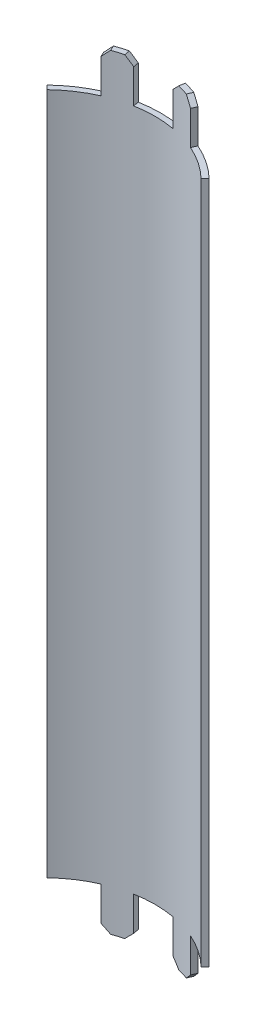
ISO-10303-21;
HEADER;
FILE_DESCRIPTION(('STEP AP214'),'2;1');
FILE_NAME('part.step','',(''),(''),'','','');
FILE_SCHEMA(('AUTOMOTIVE_DESIGN { 1 0 10303 214 1 1 1 1 }'));
ENDSEC;
DATA;
#1=APPLICATION_CONTEXT('core data for automotive mechanical design processes');
#2=APPLICATION_PROTOCOL_DEFINITION('international standard','automotive_design',2000,#1);
#3=PRODUCT_CONTEXT('',#1,'mechanical');
#4=PRODUCT('Part','Part','',(#3));
#5=PRODUCT_RELATED_PRODUCT_CATEGORY('part','',(#4));
#6=PRODUCT_DEFINITION_FORMATION('','',#4);
#7=PRODUCT_DEFINITION_CONTEXT('part definition',#1,'design');
#8=PRODUCT_DEFINITION('design','',#6,#7);
#9=PRODUCT_DEFINITION_SHAPE('','',#8);
#10=(LENGTH_UNIT() NAMED_UNIT(*) SI_UNIT(.MILLI.,.METRE.));
#11=(NAMED_UNIT(*) PLANE_ANGLE_UNIT() SI_UNIT($,.RADIAN.));
#12=(NAMED_UNIT(*) SI_UNIT($,.STERADIAN.) SOLID_ANGLE_UNIT());
#13=UNCERTAINTY_MEASURE_WITH_UNIT(LENGTH_MEASURE(1.E-05),#10,'distance_accuracy_value','');
#14=(GEOMETRIC_REPRESENTATION_CONTEXT(3) GLOBAL_UNCERTAINTY_ASSIGNED_CONTEXT((#13)) GLOBAL_UNIT_ASSIGNED_CONTEXT((#10,
#11,#12)) REPRESENTATION_CONTEXT('',''));
#15=CARTESIAN_POINT('',(0.,0.,0.));
#16=DIRECTION('',(0.,0.,1.));
#17=DIRECTION('',(1.,0.,0.));
#18=AXIS2_PLACEMENT_3D('',#15,#16,#17);
#19=CARTESIAN_POINT('',(0.,101.5,0.));
#20=DIRECTION('',(0.,-1.,0.));
#21=DIRECTION('',(0.,0.,-1.));
#22=AXIS2_PLACEMENT_3D('',#19,#20,#21);
#23=CYLINDRICAL_SURFACE('',#22,31.);
#24=DIRECTION('',(0.,-1.,0.));
#25=VECTOR('',#24,1.);
#26=CARTESIAN_POINT('',(12.5001761357445,101.5,-28.3680382926871));
#27=LINE('',#26,#25);
#28=CARTESIAN_POINT('',(12.5001761357445,-90.4999999999999,-28.3680382926871));
#29=VERTEX_POINT('',#28);
#30=CARTESIAN_POINT('',(12.5001761357445,-99.5,-28.3680382926871));
#31=VERTEX_POINT('',#30);
#32=EDGE_CURVE('E241',#29,#31,#27,.T.);
#33=ORIENTED_EDGE('',*,*,#32,.T.);
#34=CARTESIAN_POINT('',(0.,-99.5,0.));
#35=DIRECTION('',(0.647072007926405,-0.707106781186553,0.285127719729392));
#36=DIRECTION('',(-0.647072007926415,-0.707106781186542,-0.285127719729396));
#37=AXIS2_PLACEMENT_3D('',#34,#35,#36);
#38=ELLIPSE('',#37,43.8406204335656,31.);
#39=CARTESIAN_POINT('',(10.6439380549584,-101.5,-29.1154011252156));
#40=VERTEX_POINT('',#39);
#41=EDGE_CURVE('E405',#31,#40,#38,.F.);
#42=ORIENTED_EDGE('',*,*,#41,.T.);
#43=CARTESIAN_POINT('',(0.,-101.5,0.));
#44=DIRECTION('',(0.,1.,0.));
#45=DIRECTION('',(1.,0.,0.));
#46=AXIS2_PLACEMENT_3D('',#43,#44,#45);
#47=CIRCLE('',#46,31.);
#48=CARTESIAN_POINT('',(7.42170587117048,-101.5,-30.0984764059883));
#49=VERTEX_POINT('',#48);
#50=EDGE_CURVE('E375',#40,#49,#47,.T.);
#51=ORIENTED_EDGE('',*,*,#50,.T.);
#52=CARTESIAN_POINT('',(0.,-99.5,0.));
#53=DIRECTION('',(0.696034650297958,0.707106781186545,0.124642551260002));
#54=DIRECTION('',(0.696034650297954,-0.70710678118655,0.124642551260001));
#55=AXIS2_PLACEMENT_3D('',#52,#53,#54);
#56=ELLIPSE('',#55,43.8406204335661,31.);
#57=CARTESIAN_POINT('',(5.46440677966102,-99.4999999999999,-30.5145909123225));
#58=VERTEX_POINT('',#57);
#59=EDGE_CURVE('E403',#49,#58,#56,.T.);
#60=ORIENTED_EDGE('',*,*,#59,.T.);
#61=DIRECTION('',(0.,-1.,0.));
#62=VECTOR('',#61,1.);
#63=CARTESIAN_POINT('',(5.46440677966102,101.5,-30.5145909123225));
#64=LINE('',#63,#62);
#65=CARTESIAN_POINT('',(5.46440677966102,-90.4999999999999,-30.5145909123225));
#66=VERTEX_POINT('',#65);
#67=EDGE_CURVE('E294',#66,#58,#64,.T.);
#68=ORIENTED_EDGE('',*,*,#67,.F.);
#69=CARTESIAN_POINT('',(0.,-90.4999999999999,0.));
#70=DIRECTION('',(0.,-1.,0.));
#71=DIRECTION('',(0.,0.,-1.));
#72=AXIS2_PLACEMENT_3D('',#69,#70,#71);
#73=CIRCLE('',#72,31.);
#74=CARTESIAN_POINT('',(-5.46440677966102,-90.4999999999999,-30.5145909123225));
#75=VERTEX_POINT('',#74);
#76=EDGE_CURVE('E292',#75,#66,#73,.T.);
#77=ORIENTED_EDGE('',*,*,#76,.F.);
#78=DIRECTION('',(0.,-1.,0.));
#79=VECTOR('',#78,1.);
#80=CARTESIAN_POINT('',(-5.46440677966102,101.5,-30.5145909123225));
#81=LINE('',#80,#79);
#82=CARTESIAN_POINT('',(-5.46440677966102,-99.5,-30.5145909123225));
#83=VERTEX_POINT('',#82);
#84=EDGE_CURVE('E288',#75,#83,#81,.T.);
#85=ORIENTED_EDGE('',*,*,#84,.T.);
#86=CARTESIAN_POINT('',(0.,-99.5,0.));
#87=DIRECTION('',(0.696034650297953,-0.70710678118655,-0.124642551260001));
#88=DIRECTION('',(-0.696034650297959,-0.707106781186545,0.124642551260002));
#89=AXIS2_PLACEMENT_3D('',#86,#87,#88);
#90=ELLIPSE('',#89,43.8406204335658,31.);
#91=CARTESIAN_POINT('',(-7.42170587117053,-101.5,-30.0984764059883));
#92=VERTEX_POINT('',#91);
#93=EDGE_CURVE('E401',#83,#92,#90,.F.);
#94=ORIENTED_EDGE('',*,*,#93,.T.);
#95=CARTESIAN_POINT('',(-10.6439380549584,-101.5,-29.1154011252157));
#96=VERTEX_POINT('',#95);
#97=EDGE_CURVE('E362',#92,#96,#47,.T.);
#98=ORIENTED_EDGE('',*,*,#97,.T.);
#99=CARTESIAN_POINT('',(0.,-99.5,0.));
#100=DIRECTION('',(0.647072007926404,0.707106781186554,-0.285127719729392));
#101=DIRECTION('',(0.647072007926416,-0.707106781186541,-0.285127719729397));
#102=AXIS2_PLACEMENT_3D('',#99,#100,#101);
#103=ELLIPSE('',#102,43.8406204335656,31.);
#104=CARTESIAN_POINT('',(-12.5001761357445,-99.5,-28.3680382926871));
#105=VERTEX_POINT('',#104);
#106=EDGE_CURVE('E399',#96,#105,#103,.T.);
#107=ORIENTED_EDGE('',*,*,#106,.T.);
#108=DIRECTION('',(0.,-1.,0.));
#109=VECTOR('',#108,1.);
#110=CARTESIAN_POINT('',(-12.5001761357445,-90.5,-28.3680382926871));
#111=LINE('',#110,#109);
#112=CARTESIAN_POINT('',(-12.5001761357445,-90.5,-28.3680382926871));
#113=VERTEX_POINT('',#112);
#114=EDGE_CURVE('E278',#113,#105,#111,.T.);
#115=ORIENTED_EDGE('',*,*,#114,.F.);
#116=CARTESIAN_POINT('',(0.,-90.5,0.));
#117=DIRECTION('',(0.,-1.,0.));
#118=DIRECTION('',(0.,0.,-1.));
#119=AXIS2_PLACEMENT_3D('',#116,#117,#118);
#120=CIRCLE('',#119,31.);
#121=CARTESIAN_POINT('',(-21.4898305084746,-90.5,-22.3424972802289));
#122=VERTEX_POINT('',#121);
#123=EDGE_CURVE('E269',#122,#113,#120,.T.);
#124=ORIENTED_EDGE('',*,*,#123,.F.);
#125=DIRECTION('',(0.,-1.,0.));
#126=VECTOR('',#125,1.);
#127=CARTESIAN_POINT('',(-21.4898305084746,101.5,-22.3424972802289));
#128=LINE('',#127,#126);
#129=CARTESIAN_POINT('',(-21.4898305084746,90.5,-22.3424972802289));
#130=VERTEX_POINT('',#129);
#131=EDGE_CURVE('E387',#130,#122,#128,.T.);
#132=ORIENTED_EDGE('',*,*,#131,.F.);
#133=CARTESIAN_POINT('',(0.,90.5,0.));
#134=DIRECTION('',(0.,-1.,0.));
#135=DIRECTION('',(0.,0.,-1.));
#136=AXIS2_PLACEMENT_3D('',#133,#134,#135);
#137=CIRCLE('',#136,31.);
#138=CARTESIAN_POINT('',(-12.5001761357445,90.5,-28.3680382926871));
#139=VERTEX_POINT('',#138);
#140=EDGE_CURVE('E331',#139,#130,#137,.F.);
#141=ORIENTED_EDGE('',*,*,#140,.F.);
#142=DIRECTION('',(0.,-1.,0.));
#143=VECTOR('',#142,1.);
#144=CARTESIAN_POINT('',(-12.5001761357445,101.5,-28.3680382926871));
#145=LINE('',#144,#143);
#146=CARTESIAN_POINT('',(-12.5001761357445,99.5,-28.3680382926871));
#147=VERTEX_POINT('',#146);
#148=EDGE_CURVE('E333',#139,#147,#145,.F.);
#149=ORIENTED_EDGE('',*,*,#148,.T.);
#150=CARTESIAN_POINT('',(0.,99.5,0.));
#151=DIRECTION('',(0.647072007926405,-0.707106781186552,-0.285127719729392));
#152=DIRECTION('',(-0.647072007926415,-0.707106781186543,0.285127719729396));
#153=AXIS2_PLACEMENT_3D('',#150,#151,#152);
#154=ELLIPSE('',#153,43.8406204335656,31.);
#155=CARTESIAN_POINT('',(-10.6439380549584,101.5,-29.1154011252156));
#156=VERTEX_POINT('',#155);
#157=EDGE_CURVE('E391',#147,#156,#154,.T.);
#158=ORIENTED_EDGE('',*,*,#157,.T.);
#159=CARTESIAN_POINT('',(0.,101.5,0.));
#160=DIRECTION('',(0.,1.,0.));
#161=DIRECTION('',(1.,0.,0.));
#162=AXIS2_PLACEMENT_3D('',#159,#160,#161);
#163=CIRCLE('',#162,31.);
#164=CARTESIAN_POINT('',(-7.42170587117054,101.5,-30.0984764059883));
#165=VERTEX_POINT('',#164);
#166=EDGE_CURVE('E369',#165,#156,#163,.T.);
#167=ORIENTED_EDGE('',*,*,#166,.F.);
#168=CARTESIAN_POINT('',(0.,99.5,0.));
#169=DIRECTION('',(0.696034650297953,0.70710678118655,-0.124642551260001));
#170=DIRECTION('',(0.696034650297959,-0.707106781186545,-0.124642551260002));
#171=AXIS2_PLACEMENT_3D('',#168,#169,#170);
#172=ELLIPSE('',#171,43.8406204335658,31.);
#173=CARTESIAN_POINT('',(-5.46440677966102,99.5,-30.5145909123225));
#174=VERTEX_POINT('',#173);
#175=EDGE_CURVE('E393',#165,#174,#172,.F.);
#176=ORIENTED_EDGE('',*,*,#175,.T.);
#177=DIRECTION('',(0.,1.,0.));
#178=VECTOR('',#177,1.);
#179=CARTESIAN_POINT('',(-5.46440677966102,90.5,-30.5145909123225));
#180=LINE('',#179,#178);
#181=CARTESIAN_POINT('',(-5.46440677966102,90.5,-30.5145909123225));
#182=VERTEX_POINT('',#181);
#183=EDGE_CURVE('E320',#182,#174,#180,.T.);
#184=ORIENTED_EDGE('',*,*,#183,.F.);
#185=CARTESIAN_POINT('',(0.,90.5,0.));
#186=DIRECTION('',(0.,1.,0.));
#187=DIRECTION('',(0.,0.,1.));
#188=AXIS2_PLACEMENT_3D('',#185,#186,#187);
#189=CIRCLE('',#188,31.);
#190=CARTESIAN_POINT('',(5.46440677966102,90.5,-30.5145909123225));
#191=VERTEX_POINT('',#190);
#192=EDGE_CURVE('E307',#191,#182,#189,.T.);
#193=ORIENTED_EDGE('',*,*,#192,.F.);
#194=DIRECTION('',(0.,1.,0.));
#195=VECTOR('',#194,1.);
#196=CARTESIAN_POINT('',(5.46440677966102,90.5,-30.5145909123225));
#197=LINE('',#196,#195);
#198=CARTESIAN_POINT('',(5.46440677966102,99.5,-30.5145909123225));
#199=VERTEX_POINT('',#198);
#200=EDGE_CURVE('E312',#191,#199,#197,.T.);
#201=ORIENTED_EDGE('',*,*,#200,.T.);
#202=CARTESIAN_POINT('',(0.,99.5,0.));
#203=DIRECTION('',(0.696034650297958,-0.707106781186545,0.124642551260002));
#204=DIRECTION('',(-0.696034650297954,-0.70710678118655,-0.124642551260001));
#205=AXIS2_PLACEMENT_3D('',#202,#203,#204);
#206=ELLIPSE('',#205,43.8406204335661,31.);
#207=CARTESIAN_POINT('',(7.4217058711705,101.5,-30.0984764059883));
#208=VERTEX_POINT('',#207);
#209=EDGE_CURVE('E395',#199,#208,#206,.T.);
#210=ORIENTED_EDGE('',*,*,#209,.T.);
#211=CARTESIAN_POINT('',(10.6439380549584,101.5,-29.1154011252156));
#212=VERTEX_POINT('',#211);
#213=EDGE_CURVE('E365',#212,#208,#163,.T.);
#214=ORIENTED_EDGE('',*,*,#213,.F.);
#215=CARTESIAN_POINT('',(0.,99.5,0.));
#216=DIRECTION('',(0.647072007926405,0.707106781186552,0.285127719729392));
#217=DIRECTION('',(0.647072007926415,-0.707106781186543,0.285127719729396));
#218=AXIS2_PLACEMENT_3D('',#215,#216,#217);
#219=ELLIPSE('',#218,43.8406204335656,31.);
#220=CARTESIAN_POINT('',(12.5001761357445,99.5,-28.3680382926871));
#221=VERTEX_POINT('',#220);
#222=EDGE_CURVE('E397',#212,#221,#219,.F.);
#223=ORIENTED_EDGE('',*,*,#222,.T.);
#224=DIRECTION('',(0.,1.,0.));
#225=VECTOR('',#224,1.);
#226=CARTESIAN_POINT('',(12.5001761357445,90.5,-28.3680382926871));
#227=LINE('',#226,#225);
#228=CARTESIAN_POINT('',(12.5001761357445,90.5,-28.3680382926871));
#229=VERTEX_POINT('',#228);
#230=EDGE_CURVE('E352',#229,#221,#227,.T.);
#231=ORIENTED_EDGE('',*,*,#230,.F.);
#232=CARTESIAN_POINT('',(0.,90.5,0.));
#233=DIRECTION('',(0.,1.,0.));
#234=DIRECTION('',(0.,0.,1.));
#235=AXIS2_PLACEMENT_3D('',#232,#233,#234);
#236=CIRCLE('',#235,31.);
#237=CARTESIAN_POINT('',(21.4898305084746,90.5,-22.3424972802289));
#238=VERTEX_POINT('',#237);
#239=EDGE_CURVE('E345',#238,#229,#236,.T.);
#240=ORIENTED_EDGE('',*,*,#239,.F.);
#241=DIRECTION('',(0.,-1.,0.));
#242=VECTOR('',#241,1.);
#243=CARTESIAN_POINT('',(21.4898305084746,101.5,-22.3424972802289));
#244=LINE('',#243,#242);
#245=CARTESIAN_POINT('',(21.4898305084746,-90.4999999999999,-22.3424972802289));
#246=VERTEX_POINT('',#245);
#247=EDGE_CURVE('E263',#238,#246,#244,.T.);
#248=ORIENTED_EDGE('',*,*,#247,.T.);
#249=CARTESIAN_POINT('',(0.,-90.4999999999999,0.));
#250=DIRECTION('',(0.,-1.,0.));
#251=DIRECTION('',(0.,0.,-1.));
#252=AXIS2_PLACEMENT_3D('',#249,#250,#251);
#253=CIRCLE('',#252,31.);
#254=EDGE_CURVE('E251',#29,#246,#253,.T.);
#255=ORIENTED_EDGE('',*,*,#254,.F.);
#256=EDGE_LOOP('',(#33,#42,#51,#60,#68,#77,#85,#94,#98,#107,#115,#124,#132,#141,#149,#158,#167,
#176,#184,#193,#201,#210,#214,#223,#231,#240,#248,#255));
#257=FACE_BOUND('',#256,.T.);
#258=ADVANCED_FACE('F52',(#257),#23,.T.);
#259=CARTESIAN_POINT('',(0.,101.5,0.));
#260=DIRECTION('',(0.,-1.,0.));
#261=DIRECTION('',(0.,0.,-1.));
#262=AXIS2_PLACEMENT_3D('',#259,#260,#261);
#263=CYLINDRICAL_SURFACE('',#262,29.5);
#264=CARTESIAN_POINT('',(0.,-101.5,0.));
#265=DIRECTION('',(0.,1.,0.));
#266=DIRECTION('',(0.,0.,1.));
#267=AXIS2_PLACEMENT_3D('',#264,#265,#266);
#268=CIRCLE('',#267,29.5);
#269=CARTESIAN_POINT('',(10.0377636704182,-101.5,-27.739742257217));
#270=VERTEX_POINT('',#269);
#271=CARTESIAN_POINT('',(7.15671893174117,-101.5,-28.6187241877072));
#272=VERTEX_POINT('',#271);
#273=EDGE_CURVE('E379',#270,#272,#268,.T.);
#274=ORIENTED_EDGE('',*,*,#273,.F.);
#275=CARTESIAN_POINT('',(0.,-99.5,0.));
#276=DIRECTION('',(0.647072007926405,-0.707106781186553,0.285127719729392));
#277=DIRECTION('',(-0.647072007926415,-0.707106781186542,-0.285127719729396));
#278=AXIS2_PLACEMENT_3D('',#275,#276,#277);
#279=ELLIPSE('',#278,41.719300090006,29.5);
#280=CARTESIAN_POINT('',(11.8953289033698,-99.5,-26.9953912785248));
#281=VERTEX_POINT('',#280);
#282=EDGE_CURVE('E425',#270,#281,#279,.T.);
#283=ORIENTED_EDGE('',*,*,#282,.T.);
#284=DIRECTION('',(0.,-1.,0.));
#285=VECTOR('',#284,1.);
#286=CARTESIAN_POINT('',(11.8953289033698,-90.5,-26.9953912785248));
#287=LINE('',#286,#285);
#288=CARTESIAN_POINT('',(11.8953289033698,-90.5,-26.9953912785248));
#289=VERTEX_POINT('',#288);
#290=EDGE_CURVE('E264',#289,#281,#287,.T.);
#291=ORIENTED_EDGE('',*,*,#290,.F.);
#292=CARTESIAN_POINT('',(0.,-90.5,0.));
#293=DIRECTION('',(0.,-1.,0.));
#294=DIRECTION('',(0.,0.,-1.));
#295=AXIS2_PLACEMENT_3D('',#292,#293,#294);
#296=CIRCLE('',#295,29.5);
#297=CARTESIAN_POINT('',(20.45,-90.5,-21.2614087021533));
#298=VERTEX_POINT('',#297);
#299=EDGE_CURVE('E257',#289,#298,#296,.T.);
#300=ORIENTED_EDGE('',*,*,#299,.T.);
#301=DIRECTION('',(0.,-1.,0.));
#302=VECTOR('',#301,1.);
#303=CARTESIAN_POINT('',(20.45,101.5,-21.2614087021533));
#304=LINE('',#303,#302);
#305=CARTESIAN_POINT('',(20.45,90.5,-21.2614087021533));
#306=VERTEX_POINT('',#305);
#307=EDGE_CURVE('E381',#306,#298,#304,.T.);
#308=ORIENTED_EDGE('',*,*,#307,.F.);
#309=CARTESIAN_POINT('',(0.,90.5,0.));
#310=DIRECTION('',(0.,-1.,0.));
#311=DIRECTION('',(0.,0.,-1.));
#312=AXIS2_PLACEMENT_3D('',#309,#310,#311);
#313=CIRCLE('',#312,29.5);
#314=CARTESIAN_POINT('',(11.8953289033698,90.5,-26.9953912785248));
#315=VERTEX_POINT('',#314);
#316=EDGE_CURVE('E348',#306,#315,#313,.F.);
#317=ORIENTED_EDGE('',*,*,#316,.T.);
#318=DIRECTION('',(0.,-1.,0.));
#319=VECTOR('',#318,1.);
#320=CARTESIAN_POINT('',(11.8953289033698,101.5,-26.9953912785248));
#321=LINE('',#320,#319);
#322=CARTESIAN_POINT('',(11.8953289033698,99.5,-26.9953912785248));
#323=VERTEX_POINT('',#322);
#324=EDGE_CURVE('E351',#315,#323,#321,.F.);
#325=ORIENTED_EDGE('',*,*,#324,.T.);
#326=CARTESIAN_POINT('',(0.,99.5,0.));
#327=DIRECTION('',(0.647072007926405,0.707106781186552,0.285127719729392));
#328=DIRECTION('',(0.647072007926415,-0.707106781186543,0.285127719729396));
#329=AXIS2_PLACEMENT_3D('',#326,#327,#328);
#330=ELLIPSE('',#329,41.719300090006,29.5);
#331=CARTESIAN_POINT('',(10.0377636704182,101.5,-27.739742257217));
#332=VERTEX_POINT('',#331);
#333=EDGE_CURVE('E418',#323,#332,#330,.T.);
#334=ORIENTED_EDGE('',*,*,#333,.T.);
#335=CARTESIAN_POINT('',(0.,101.5,0.));
#336=DIRECTION('',(0.,1.,0.));
#337=DIRECTION('',(0.,0.,1.));
#338=AXIS2_PLACEMENT_3D('',#335,#336,#337);
#339=CIRCLE('',#338,29.5);
#340=CARTESIAN_POINT('',(7.1567189317412,101.5,-28.6187241877072));
#341=VERTEX_POINT('',#340);
#342=EDGE_CURVE('E372',#332,#341,#339,.T.);
#343=ORIENTED_EDGE('',*,*,#342,.T.);
#344=CARTESIAN_POINT('',(0.,99.5,0.));
#345=DIRECTION('',(0.696034650297958,-0.707106781186545,0.124642551260002));
#346=DIRECTION('',(-0.696034650297954,-0.70710678118655,-0.124642551260001));
#347=AXIS2_PLACEMENT_3D('',#344,#345,#346);
#348=ELLIPSE('',#347,41.7193000900064,29.5);
#349=CARTESIAN_POINT('',(5.2,99.5,-29.038078448823));
#350=VERTEX_POINT('',#349);
#351=EDGE_CURVE('E416',#341,#350,#348,.F.);
#352=ORIENTED_EDGE('',*,*,#351,.T.);
#353=DIRECTION('',(0.,-1.,0.));
#354=VECTOR('',#353,1.);
#355=CARTESIAN_POINT('',(5.2,101.5,-29.038078448823));
#356=LINE('',#355,#354);
#357=CARTESIAN_POINT('',(5.2,90.5,-29.038078448823));
#358=VERTEX_POINT('',#357);
#359=EDGE_CURVE('E313',#358,#350,#356,.F.);
#360=ORIENTED_EDGE('',*,*,#359,.F.);
#361=CARTESIAN_POINT('',(0.,90.5,0.));
#362=DIRECTION('',(0.,-1.,0.));
#363=DIRECTION('',(0.,0.,-1.));
#364=AXIS2_PLACEMENT_3D('',#361,#362,#363);
#365=CIRCLE('',#364,29.5);
#366=CARTESIAN_POINT('',(-5.2,90.5,-29.038078448823));
#367=VERTEX_POINT('',#366);
#368=EDGE_CURVE('E308',#358,#367,#365,.F.);
#369=ORIENTED_EDGE('',*,*,#368,.T.);
#370=DIRECTION('',(0.,-1.,0.));
#371=VECTOR('',#370,1.);
#372=CARTESIAN_POINT('',(-5.2,101.5,-29.038078448823));
#373=LINE('',#372,#371);
#374=CARTESIAN_POINT('',(-5.2,99.5,-29.038078448823));
#375=VERTEX_POINT('',#374);
#376=EDGE_CURVE('E311',#367,#375,#373,.F.);
#377=ORIENTED_EDGE('',*,*,#376,.T.);
#378=CARTESIAN_POINT('',(0.,99.5,0.));
#379=DIRECTION('',(0.696034650297953,0.70710678118655,-0.124642551260001));
#380=DIRECTION('',(0.696034650297959,-0.707106781186545,-0.124642551260002));
#381=AXIS2_PLACEMENT_3D('',#378,#379,#380);
#382=ELLIPSE('',#381,41.7193000900062,29.5);
#383=CARTESIAN_POINT('',(-7.15671893174123,101.5,-28.6187241877072));
#384=VERTEX_POINT('',#383);
#385=EDGE_CURVE('E414',#375,#384,#382,.T.);
#386=ORIENTED_EDGE('',*,*,#385,.T.);
#387=CARTESIAN_POINT('',(-10.0377636704182,101.5,-27.739742257217));
#388=VERTEX_POINT('',#387);
#389=EDGE_CURVE('E368',#384,#388,#339,.T.);
#390=ORIENTED_EDGE('',*,*,#389,.T.);
#391=CARTESIAN_POINT('',(0.,99.5,0.));
#392=DIRECTION('',(0.647072007926405,-0.707106781186552,-0.285127719729392));
#393=DIRECTION('',(-0.647072007926415,-0.707106781186543,0.285127719729396));
#394=AXIS2_PLACEMENT_3D('',#391,#392,#393);
#395=ELLIPSE('',#394,41.719300090006,29.5);
#396=CARTESIAN_POINT('',(-11.8953289033698,99.5,-26.9953912785248));
#397=VERTEX_POINT('',#396);
#398=EDGE_CURVE('E412',#388,#397,#395,.F.);
#399=ORIENTED_EDGE('',*,*,#398,.T.);
#400=DIRECTION('',(0.,1.,0.));
#401=VECTOR('',#400,1.);
#402=CARTESIAN_POINT('',(-11.8953289033698,90.5,-26.9953912785248));
#403=LINE('',#402,#401);
#404=CARTESIAN_POINT('',(-11.8953289033698,90.5,-26.9953912785248));
#405=VERTEX_POINT('',#404);
#406=EDGE_CURVE('E334',#405,#397,#403,.T.);
#407=ORIENTED_EDGE('',*,*,#406,.F.);
#408=CARTESIAN_POINT('',(0.,90.5,0.));
#409=DIRECTION('',(0.,1.,0.));
#410=DIRECTION('',(0.,0.,1.));
#411=AXIS2_PLACEMENT_3D('',#408,#409,#410);
#412=CIRCLE('',#411,29.5);
#413=CARTESIAN_POINT('',(-20.45,90.5,-21.2614087021533));
#414=VERTEX_POINT('',#413);
#415=EDGE_CURVE('E328',#405,#414,#412,.T.);
#416=ORIENTED_EDGE('',*,*,#415,.T.);
#417=DIRECTION('',(0.,-1.,0.));
#418=VECTOR('',#417,1.);
#419=CARTESIAN_POINT('',(-20.45,101.5,-21.2614087021533));
#420=LINE('',#419,#418);
#421=CARTESIAN_POINT('',(-20.45,-90.4999999999999,-21.2614087021533));
#422=VERTEX_POINT('',#421);
#423=EDGE_CURVE('E384',#414,#422,#420,.T.);
#424=ORIENTED_EDGE('',*,*,#423,.T.);
#425=CARTESIAN_POINT('',(0.,-90.4999999999999,0.));
#426=DIRECTION('',(0.,-1.,0.));
#427=DIRECTION('',(0.,0.,-1.));
#428=AXIS2_PLACEMENT_3D('',#425,#426,#427);
#429=CIRCLE('',#428,29.5);
#430=CARTESIAN_POINT('',(-11.8953289033698,-90.4999999999999,-26.9953912785248));
#431=VERTEX_POINT('',#430);
#432=EDGE_CURVE('E275',#422,#431,#429,.T.);
#433=ORIENTED_EDGE('',*,*,#432,.T.);
#434=DIRECTION('',(0.,-1.,0.));
#435=VECTOR('',#434,1.);
#436=CARTESIAN_POINT('',(-11.8953289033698,101.5,-26.9953912785248));
#437=LINE('',#436,#435);
#438=CARTESIAN_POINT('',(-11.8953289033698,-99.5,-26.9953912785248));
#439=VERTEX_POINT('',#438);
#440=EDGE_CURVE('E271',#431,#439,#437,.T.);
#441=ORIENTED_EDGE('',*,*,#440,.T.);
#442=CARTESIAN_POINT('',(0.,-99.5,0.));
#443=DIRECTION('',(0.647072007926404,0.707106781186554,-0.285127719729392));
#444=DIRECTION('',(0.647072007926416,-0.707106781186541,-0.285127719729397));
#445=AXIS2_PLACEMENT_3D('',#442,#443,#444);
#446=ELLIPSE('',#445,41.7193000900059,29.5);
#447=CARTESIAN_POINT('',(-10.0377636704182,-101.5,-27.739742257217));
#448=VERTEX_POINT('',#447);
#449=EDGE_CURVE('E420',#439,#448,#446,.F.);
#450=ORIENTED_EDGE('',*,*,#449,.T.);
#451=CARTESIAN_POINT('',(-7.1567189317412,-101.5,-28.6187241877072));
#452=VERTEX_POINT('',#451);
#453=EDGE_CURVE('E376',#452,#448,#268,.T.);
#454=ORIENTED_EDGE('',*,*,#453,.F.);
#455=CARTESIAN_POINT('',(0.,-99.5,0.));
#456=DIRECTION('',(0.696034650297953,-0.70710678118655,-0.124642551260001));
#457=DIRECTION('',(-0.696034650297959,-0.707106781186545,0.124642551260002));
#458=AXIS2_PLACEMENT_3D('',#455,#456,#457);
#459=ELLIPSE('',#458,41.7193000900062,29.5);
#460=CARTESIAN_POINT('',(-5.2,-99.5,-29.038078448823));
#461=VERTEX_POINT('',#460);
#462=EDGE_CURVE('E75',#452,#461,#459,.T.);
#463=ORIENTED_EDGE('',*,*,#462,.T.);
#464=DIRECTION('',(0.,-1.,0.));
#465=VECTOR('',#464,1.);
#466=CARTESIAN_POINT('',(-5.2,-90.5,-29.038078448823));
#467=LINE('',#466,#465);
#468=CARTESIAN_POINT('',(-5.2,-90.5,-29.038078448823));
#469=VERTEX_POINT('',#468);
#470=EDGE_CURVE('E296',#469,#461,#467,.T.);
#471=ORIENTED_EDGE('',*,*,#470,.F.);
#472=CARTESIAN_POINT('',(0.,-90.5,0.));
#473=DIRECTION('',(0.,-1.,0.));
#474=DIRECTION('',(0.,0.,-1.));
#475=AXIS2_PLACEMENT_3D('',#472,#473,#474);
#476=CIRCLE('',#475,29.5);
#477=CARTESIAN_POINT('',(5.2,-90.5,-29.038078448823));
#478=VERTEX_POINT('',#477);
#479=EDGE_CURVE('E298',#469,#478,#476,.T.);
#480=ORIENTED_EDGE('',*,*,#479,.T.);
#481=DIRECTION('',(0.,-1.,0.));
#482=VECTOR('',#481,1.);
#483=CARTESIAN_POINT('',(5.2,-90.5,-29.038078448823));
#484=LINE('',#483,#482);
#485=CARTESIAN_POINT('',(5.2,-99.5,-29.038078448823));
#486=VERTEX_POINT('',#485);
#487=EDGE_CURVE('E285',#478,#486,#484,.T.);
#488=ORIENTED_EDGE('',*,*,#487,.T.);
#489=CARTESIAN_POINT('',(0.,-99.5,0.));
#490=DIRECTION('',(0.696034650297958,0.707106781186545,0.124642551260002));
#491=DIRECTION('',(0.696034650297954,-0.70710678118655,0.124642551260001));
#492=AXIS2_PLACEMENT_3D('',#489,#490,#491);
#493=ELLIPSE('',#492,41.7193000900064,29.5);
#494=EDGE_CURVE('E423',#486,#272,#493,.F.);
#495=ORIENTED_EDGE('',*,*,#494,.T.);
#496=EDGE_LOOP('',(#274,#283,#291,#300,#308,#317,#325,#334,#343,#352,#360,#369,#377,#386,#390,
#399,#407,#416,#424,#433,#441,#450,#454,#463,#471,#480,#488,#495));
#497=FACE_BOUND('',#496,.T.);
#498=ADVANCED_FACE('F468',(#497),#263,.F.);
#499=CARTESIAN_POINT('',(0.,-101.5,0.));
#500=DIRECTION('',(0.,1.,0.));
#501=DIRECTION('',(1.,0.,0.));
#502=AXIS2_PLACEMENT_3D('',#499,#500,#501);
#503=PLANE('',#502);
#504=ORIENTED_EDGE('',*,*,#50,.F.);
#505=DIRECTION('',(-0.403231488249824,0.,0.91509800944152));
#506=VECTOR('',#505,1.);
#507=CARTESIAN_POINT('',(10.0651328844867,-101.5,-27.8018542550245));
#508=LINE('',#507,#506);
#509=EDGE_CURVE('E410',#40,#270,#508,.T.);
#510=ORIENTED_EDGE('',*,*,#509,.T.);
#511=ORIENTED_EDGE('',*,*,#273,.T.);
#512=DIRECTION('',(0.176271186440678,0.,-0.984341642332984));
#513=VECTOR('',#512,1.);
#514=CARTESIAN_POINT('',(7.43309006432697,-101.5,-30.1620485394411));
#515=LINE('',#514,#513);
#516=EDGE_CURVE('E407',#272,#49,#515,.T.);
#517=ORIENTED_EDGE('',*,*,#516,.T.);
#518=EDGE_LOOP('',(#504,#510,#511,#517));
#519=FACE_BOUND('',#518,.T.);
#520=ADVANCED_FACE('F506',(#519),#503,.F.);
#521=CARTESIAN_POINT('',(21.4898305084746,101.5,-22.3424972802289));
#522=DIRECTION('',(0.720725718717062,0.,0.69322033898305));
#523=DIRECTION('',(0.69322033898305,0.,-0.720725718717062));
#524=AXIS2_PLACEMENT_3D('',#521,#522,#523);
#525=PLANE('',#524);
#526=ORIENTED_EDGE('',*,*,#307,.T.);
#527=DIRECTION('',(-0.693220338983051,0.,0.720725718717061));
#528=VECTOR('',#527,1.);
#529=CARTESIAN_POINT('',(20.45,-90.5,-21.2614087021533));
#530=LINE('',#529,#528);
#531=EDGE_CURVE('E258',#298,#246,#530,.F.);
#532=ORIENTED_EDGE('',*,*,#531,.T.);
#533=ORIENTED_EDGE('',*,*,#247,.F.);
#534=DIRECTION('',(0.693220338983051,0.,-0.720725718717061));
#535=VECTOR('',#534,1.);
#536=CARTESIAN_POINT('',(21.4898305084746,90.5,-22.3424972802289));
#537=LINE('',#536,#535);
#538=EDGE_CURVE('E359',#238,#306,#537,.F.);
#539=ORIENTED_EDGE('',*,*,#538,.T.);
#540=EDGE_LOOP('',(#526,#532,#533,#539));
#541=FACE_BOUND('',#540,.T.);
#542=ADVANCED_FACE('F497',(#541),#525,.T.);
#543=ORIENTED_EDGE('',*,*,#97,.F.);
#544=DIRECTION('',(0.176271186440678,0.,0.984341642332984));
#545=VECTOR('',#544,1.);
#546=CARTESIAN_POINT('',(-7.16868328466601,-101.5,-28.6855360759417));
#547=LINE('',#546,#545);
#548=EDGE_CURVE('E433',#92,#452,#547,.T.);
#549=ORIENTED_EDGE('',*,*,#548,.T.);
#550=ORIENTED_EDGE('',*,*,#453,.T.);
#551=DIRECTION('',(-0.403231488249824,0.,-0.91509800944152));
#552=VECTOR('',#551,1.);
#553=CARTESIAN_POINT('',(-10.6699801168614,-101.5,-29.1745012691868));
#554=LINE('',#553,#552);
#555=EDGE_CURVE('E431',#448,#96,#554,.T.);
#556=ORIENTED_EDGE('',*,*,#555,.T.);
#557=EDGE_LOOP('',(#543,#549,#550,#556));
#558=FACE_BOUND('',#557,.T.);
#559=ADVANCED_FACE('F528',(#558),#503,.F.);
#560=CARTESIAN_POINT('',(-20.45,101.5,-21.2614087021533));
#561=DIRECTION('',(-0.720725718717061,0.,0.693220338983051));
#562=DIRECTION('',(0.693220338983051,0.,0.720725718717061));
#563=AXIS2_PLACEMENT_3D('',#560,#561,#562);
#564=PLANE('',#563);
#565=ORIENTED_EDGE('',*,*,#131,.T.);
#566=DIRECTION('',(-0.693220338983051,0.,-0.720725718717061));
#567=VECTOR('',#566,1.);
#568=CARTESIAN_POINT('',(-21.4898305084746,-90.5,-22.3424972802289));
#569=LINE('',#568,#567);
#570=EDGE_CURVE('E274',#122,#422,#569,.F.);
#571=ORIENTED_EDGE('',*,*,#570,.T.);
#572=ORIENTED_EDGE('',*,*,#423,.F.);
#573=DIRECTION('',(0.693220338983051,0.,0.720725718717061));
#574=VECTOR('',#573,1.);
#575=CARTESIAN_POINT('',(-20.45,90.5,-21.2614087021533));
#576=LINE('',#575,#574);
#577=EDGE_CURVE('E342',#414,#130,#576,.F.);
#578=ORIENTED_EDGE('',*,*,#577,.T.);
#579=EDGE_LOOP('',(#565,#571,#572,#578));
#580=FACE_BOUND('',#579,.T.);
#581=ADVANCED_FACE('F543',(#580),#564,.T.);
#582=CARTESIAN_POINT('',(0.,101.5,0.));
#583=DIRECTION('',(0.,1.,0.));
#584=DIRECTION('',(1.,0.,0.));
#585=AXIS2_PLACEMENT_3D('',#582,#583,#584);
#586=PLANE('',#585);
#587=ORIENTED_EDGE('',*,*,#342,.F.);
#588=DIRECTION('',(0.403231488249824,0.,-0.91509800944152));
#589=VECTOR('',#588,1.);
#590=CARTESIAN_POINT('',(-1.83019601888307,101.5,-0.806462976499661));
#591=LINE('',#590,#589);
#592=EDGE_CURVE('E444',#332,#212,#591,.T.);
#593=ORIENTED_EDGE('',*,*,#592,.T.);
#594=ORIENTED_EDGE('',*,*,#213,.T.);
#595=DIRECTION('',(-0.176271186440678,0.,0.984341642332984));
#596=VECTOR('',#595,1.);
#597=CARTESIAN_POINT('',(1.96868328466598,101.5,0.352542372881359));
#598=LINE('',#597,#596);
#599=EDGE_CURVE('E441',#208,#341,#598,.T.);
#600=ORIENTED_EDGE('',*,*,#599,.T.);
#601=EDGE_LOOP('',(#587,#593,#594,#600));
#602=FACE_BOUND('',#601,.T.);
#603=ADVANCED_FACE('F485',(#602),#586,.T.);
#604=ORIENTED_EDGE('',*,*,#389,.F.);
#605=DIRECTION('',(-0.176271186440678,0.,-0.984341642332984));
#606=VECTOR('',#605,1.);
#607=CARTESIAN_POINT('',(-1.96868328466601,101.5,0.352542372881364));
#608=LINE('',#607,#606);
#609=EDGE_CURVE('E60',#384,#165,#608,.T.);
#610=ORIENTED_EDGE('',*,*,#609,.T.);
#611=ORIENTED_EDGE('',*,*,#166,.T.);
#612=DIRECTION('',(0.403231488249824,0.,0.91509800944152));
#613=VECTOR('',#612,1.);
#614=CARTESIAN_POINT('',(1.83019601888307,101.5,-0.806462976499661));
#615=LINE('',#614,#613);
#616=EDGE_CURVE('E451',#156,#388,#615,.T.);
#617=ORIENTED_EDGE('',*,*,#616,.T.);
#618=EDGE_LOOP('',(#604,#610,#611,#617));
#619=FACE_BOUND('',#618,.T.);
#620=ADVANCED_FACE('F457',(#619),#586,.T.);
#621=CARTESIAN_POINT('',(0.,90.5,0.));
#622=DIRECTION('',(0.,-1.,0.));
#623=DIRECTION('',(0.,0.,-1.));
#624=AXIS2_PLACEMENT_3D('',#621,#622,#623);
#625=PLANE('',#624);
#626=ORIENTED_EDGE('',*,*,#538,.F.);
#627=ORIENTED_EDGE('',*,*,#239,.T.);
#628=DIRECTION('',(0.403231488249824,0.,-0.91509800944152));
#629=VECTOR('',#628,1.);
#630=CARTESIAN_POINT('',(12.5001761357445,90.5,-28.3680382926871));
#631=LINE('',#630,#629);
#632=EDGE_CURVE('E355',#229,#315,#631,.F.);
#633=ORIENTED_EDGE('',*,*,#632,.T.);
#634=ORIENTED_EDGE('',*,*,#316,.F.);
#635=EDGE_LOOP('',(#626,#627,#633,#634));
#636=FACE_BOUND('',#635,.T.);
#637=ADVANCED_FACE('F783',(#636),#625,.F.);
#638=CARTESIAN_POINT('',(12.5001761357445,96.,-28.3680382926871));
#639=DIRECTION('',(-0.91509800944152,0.,-0.403231488249824));
#640=DIRECTION('',(0.,1.,0.));
#641=AXIS2_PLACEMENT_3D('',#638,#639,#640);
#642=PLANE('',#641);
#643=ORIENTED_EDGE('',*,*,#230,.T.);
#644=DIRECTION('',(0.403231488249824,0.,-0.91509800944152));
#645=VECTOR('',#644,1.);
#646=CARTESIAN_POINT('',(12.5001761357445,99.5,-28.3680382926871));
#647=LINE('',#646,#645);
#648=EDGE_CURVE('E438',#221,#323,#647,.F.);
#649=ORIENTED_EDGE('',*,*,#648,.T.);
#650=ORIENTED_EDGE('',*,*,#324,.F.);
#651=ORIENTED_EDGE('',*,*,#632,.F.);
#652=EDGE_LOOP('',(#643,#649,#650,#651));
#653=FACE_BOUND('',#652,.T.);
#654=ADVANCED_FACE('F492',(#653),#642,.F.);
#655=CARTESIAN_POINT('',(0.,90.5,0.));
#656=DIRECTION('',(0.,-1.,0.));
#657=DIRECTION('',(0.,0.,-1.));
#658=AXIS2_PLACEMENT_3D('',#655,#656,#657);
#659=PLANE('',#658);
#660=ORIENTED_EDGE('',*,*,#577,.F.);
#661=ORIENTED_EDGE('',*,*,#415,.F.);
#662=DIRECTION('',(0.403231488249824,0.,0.91509800944152));
#663=VECTOR('',#662,1.);
#664=CARTESIAN_POINT('',(-11.8953289033698,90.5,-26.9953912785248));
#665=LINE('',#664,#663);
#666=EDGE_CURVE('E337',#405,#139,#665,.F.);
#667=ORIENTED_EDGE('',*,*,#666,.T.);
#668=ORIENTED_EDGE('',*,*,#140,.T.);
#669=EDGE_LOOP('',(#660,#661,#667,#668));
#670=FACE_BOUND('',#669,.T.);
#671=ADVANCED_FACE('F547',(#670),#659,.F.);
#672=CARTESIAN_POINT('',(-11.8953289033698,96.,-26.9953912785248));
#673=DIRECTION('',(-0.91509800944152,0.,0.403231488249824));
#674=DIRECTION('',(0.,1.,0.));
#675=AXIS2_PLACEMENT_3D('',#672,#673,#674);
#676=PLANE('',#675);
#677=ORIENTED_EDGE('',*,*,#406,.T.);
#678=DIRECTION('',(-0.403231488249824,0.,-0.91509800944152));
#679=VECTOR('',#678,1.);
#680=CARTESIAN_POINT('',(-11.8953289033698,99.5,-26.9953912785248));
#681=LINE('',#680,#679);
#682=EDGE_CURVE('E14',#397,#147,#681,.T.);
#683=ORIENTED_EDGE('',*,*,#682,.T.);
#684=ORIENTED_EDGE('',*,*,#148,.F.);
#685=ORIENTED_EDGE('',*,*,#666,.F.);
#686=EDGE_LOOP('',(#677,#683,#684,#685));
#687=FACE_BOUND('',#686,.T.);
#688=ADVANCED_FACE('F550',(#687),#676,.T.);
#689=CARTESIAN_POINT('',(5.46440677966102,96.,-30.5145909123225));
#690=DIRECTION('',(-0.984341642332984,0.,-0.176271186440678));
#691=DIRECTION('',(0.,1.,0.));
#692=AXIS2_PLACEMENT_3D('',#689,#690,#691);
#693=PLANE('',#692);
#694=ORIENTED_EDGE('',*,*,#359,.T.);
#695=DIRECTION('',(0.176271186440678,0.,-0.984341642332984));
#696=VECTOR('',#695,1.);
#697=CARTESIAN_POINT('',(5.46440677966102,99.5,-30.5145909123225));
#698=LINE('',#697,#696);
#699=EDGE_CURVE('E446',#350,#199,#698,.T.);
#700=ORIENTED_EDGE('',*,*,#699,.T.);
#701=ORIENTED_EDGE('',*,*,#200,.F.);
#702=DIRECTION('',(0.176271186440678,0.,-0.984341642332984));
#703=VECTOR('',#702,1.);
#704=CARTESIAN_POINT('',(5.46440677966102,90.5,-30.5145909123225));
#705=LINE('',#704,#703);
#706=EDGE_CURVE('E325',#191,#358,#705,.F.);
#707=ORIENTED_EDGE('',*,*,#706,.T.);
#708=EDGE_LOOP('',(#694,#700,#701,#707));
#709=FACE_BOUND('',#708,.T.);
#710=ADVANCED_FACE('F475',(#709),#693,.T.);
#711=CARTESIAN_POINT('',(0.,90.5,0.));
#712=DIRECTION('',(0.,-1.,0.));
#713=DIRECTION('',(0.,0.,-1.));
#714=AXIS2_PLACEMENT_3D('',#711,#712,#713);
#715=PLANE('',#714);
#716=ORIENTED_EDGE('',*,*,#706,.F.);
#717=ORIENTED_EDGE('',*,*,#192,.T.);
#718=DIRECTION('',(-0.176271186440678,0.,-0.984341642332984));
#719=VECTOR('',#718,1.);
#720=CARTESIAN_POINT('',(-5.46440677966102,90.5,-30.5145909123225));
#721=LINE('',#720,#719);
#722=EDGE_CURVE('E316',#182,#367,#721,.F.);
#723=ORIENTED_EDGE('',*,*,#722,.T.);
#724=ORIENTED_EDGE('',*,*,#368,.F.);
#725=EDGE_LOOP('',(#716,#717,#723,#724));
#726=FACE_BOUND('',#725,.T.);
#727=ADVANCED_FACE('F472',(#726),#715,.F.);
#728=CARTESIAN_POINT('',(-5.46440677966102,96.,-30.5145909123225));
#729=DIRECTION('',(-0.984341642332984,0.,0.176271186440678));
#730=DIRECTION('',(0.,1.,0.));
#731=AXIS2_PLACEMENT_3D('',#728,#729,#730);
#732=PLANE('',#731);
#733=ORIENTED_EDGE('',*,*,#183,.T.);
#734=DIRECTION('',(-0.176271186440678,0.,-0.984341642332984));
#735=VECTOR('',#734,1.);
#736=CARTESIAN_POINT('',(-5.46440677966102,99.5,-30.5145909123225));
#737=LINE('',#736,#735);
#738=EDGE_CURVE('E448',#174,#375,#737,.F.);
#739=ORIENTED_EDGE('',*,*,#738,.T.);
#740=ORIENTED_EDGE('',*,*,#376,.F.);
#741=ORIENTED_EDGE('',*,*,#722,.F.);
#742=EDGE_LOOP('',(#733,#739,#740,#741));
#743=FACE_BOUND('',#742,.T.);
#744=ADVANCED_FACE('F465',(#743),#732,.F.);
#745=CARTESIAN_POINT('',(0.,-90.5,0.));
#746=DIRECTION('',(0.,1.,0.));
#747=DIRECTION('',(0.,0.,1.));
#748=AXIS2_PLACEMENT_3D('',#745,#746,#747);
#749=PLANE('',#748);
#750=DIRECTION('',(-0.176271186440678,0.,0.984341642332984));
#751=VECTOR('',#750,1.);
#752=CARTESIAN_POINT('',(5.2,-90.5,-29.038078448823));
#753=LINE('',#752,#751);
#754=EDGE_CURVE('E304',#478,#66,#753,.F.);
#755=ORIENTED_EDGE('',*,*,#754,.F.);
#756=ORIENTED_EDGE('',*,*,#479,.F.);
#757=DIRECTION('',(0.176271186440678,0.,0.984341642332984));
#758=VECTOR('',#757,1.);
#759=CARTESIAN_POINT('',(-5.2,-90.5,-29.038078448823));
#760=LINE('',#759,#758);
#761=EDGE_CURVE('E291',#469,#75,#760,.F.);
#762=ORIENTED_EDGE('',*,*,#761,.T.);
#763=ORIENTED_EDGE('',*,*,#76,.T.);
#764=EDGE_LOOP('',(#755,#756,#762,#763));
#765=FACE_BOUND('',#764,.T.);
#766=ADVANCED_FACE('F517',(#765),#749,.F.);
#767=CARTESIAN_POINT('',(-5.2,-96.,-29.038078448823));
#768=DIRECTION('',(0.984341642332984,0.,-0.176271186440678));
#769=DIRECTION('',(0.,-1.,0.));
#770=AXIS2_PLACEMENT_3D('',#767,#768,#769);
#771=PLANE('',#770);
#772=ORIENTED_EDGE('',*,*,#470,.T.);
#773=DIRECTION('',(-0.176271186440678,0.,-0.984341642332984));
#774=VECTOR('',#773,1.);
#775=CARTESIAN_POINT('',(-5.46440677966101,-99.5,-30.5145909123225));
#776=LINE('',#775,#774);
#777=EDGE_CURVE('E428',#461,#83,#776,.T.);
#778=ORIENTED_EDGE('',*,*,#777,.T.);
#779=ORIENTED_EDGE('',*,*,#84,.F.);
#780=ORIENTED_EDGE('',*,*,#761,.F.);
#781=EDGE_LOOP('',(#772,#778,#779,#780));
#782=FACE_BOUND('',#781,.T.);
#783=ADVANCED_FACE('F521',(#782),#771,.T.);
#784=CARTESIAN_POINT('',(5.2,-96.,-29.038078448823));
#785=DIRECTION('',(0.984341642332984,0.,0.176271186440678));
#786=DIRECTION('',(0.,-1.,0.));
#787=AXIS2_PLACEMENT_3D('',#784,#785,#786);
#788=PLANE('',#787);
#789=ORIENTED_EDGE('',*,*,#67,.T.);
#790=DIRECTION('',(0.176271186440678,0.,-0.984341642332984));
#791=VECTOR('',#790,1.);
#792=CARTESIAN_POINT('',(5.2,-99.5,-29.038078448823));
#793=LINE('',#792,#791);
#794=EDGE_CURVE('E67',#58,#486,#793,.F.);
#795=ORIENTED_EDGE('',*,*,#794,.T.);
#796=ORIENTED_EDGE('',*,*,#487,.F.);
#797=ORIENTED_EDGE('',*,*,#754,.T.);
#798=EDGE_LOOP('',(#789,#795,#796,#797));
#799=FACE_BOUND('',#798,.T.);
#800=ADVANCED_FACE('F514',(#799),#788,.F.);
#801=CARTESIAN_POINT('',(-12.5001761357445,-96.,-28.3680382926871));
#802=DIRECTION('',(0.91509800944152,0.,-0.403231488249824));
#803=DIRECTION('',(0.,-1.,0.));
#804=AXIS2_PLACEMENT_3D('',#801,#802,#803);
#805=PLANE('',#804);
#806=ORIENTED_EDGE('',*,*,#114,.T.);
#807=DIRECTION('',(-0.403231488249824,0.,-0.91509800944152));
#808=VECTOR('',#807,1.);
#809=CARTESIAN_POINT('',(-11.8953289033698,-99.5,-26.9953912785248));
#810=LINE('',#809,#808);
#811=EDGE_CURVE('E435',#105,#439,#810,.F.);
#812=ORIENTED_EDGE('',*,*,#811,.T.);
#813=ORIENTED_EDGE('',*,*,#440,.F.);
#814=DIRECTION('',(-0.403231488249824,0.,-0.91509800944152));
#815=VECTOR('',#814,1.);
#816=CARTESIAN_POINT('',(-12.5001761357445,-90.5,-28.3680382926871));
#817=LINE('',#816,#815);
#818=EDGE_CURVE('E282',#113,#431,#817,.F.);
#819=ORIENTED_EDGE('',*,*,#818,.F.);
#820=EDGE_LOOP('',(#806,#812,#813,#819));
#821=FACE_BOUND('',#820,.T.);
#822=ADVANCED_FACE('F537',(#821),#805,.F.);
#823=CARTESIAN_POINT('',(0.,-90.5,0.));
#824=DIRECTION('',(0.,1.,0.));
#825=DIRECTION('',(0.,0.,1.));
#826=AXIS2_PLACEMENT_3D('',#823,#824,#825);
#827=PLANE('',#826);
#828=ORIENTED_EDGE('',*,*,#123,.T.);
#829=ORIENTED_EDGE('',*,*,#818,.T.);
#830=ORIENTED_EDGE('',*,*,#432,.F.);
#831=ORIENTED_EDGE('',*,*,#570,.F.);
#832=EDGE_LOOP('',(#828,#829,#830,#831));
#833=FACE_BOUND('',#832,.T.);
#834=ADVANCED_FACE('F539',(#833),#827,.F.);
#835=CARTESIAN_POINT('',(0.,-90.5,0.));
#836=DIRECTION('',(0.,1.,0.));
#837=DIRECTION('',(0.,0.,1.));
#838=AXIS2_PLACEMENT_3D('',#835,#836,#837);
#839=PLANE('',#838);
#840=ORIENTED_EDGE('',*,*,#531,.F.);
#841=ORIENTED_EDGE('',*,*,#299,.F.);
#842=DIRECTION('',(-0.403231488249824,0.,0.91509800944152));
#843=VECTOR('',#842,1.);
#844=CARTESIAN_POINT('',(11.8953289033698,-90.5,-26.9953912785248));
#845=LINE('',#844,#843);
#846=EDGE_CURVE('E245',#289,#29,#845,.F.);
#847=ORIENTED_EDGE('',*,*,#846,.T.);
#848=ORIENTED_EDGE('',*,*,#254,.T.);
#849=EDGE_LOOP('',(#840,#841,#847,#848));
#850=FACE_BOUND('',#849,.T.);
#851=ADVANCED_FACE('F254',(#850),#839,.F.);
#852=CARTESIAN_POINT('',(11.8953289033698,-96.,-26.9953912785248));
#853=DIRECTION('',(0.91509800944152,0.,0.403231488249824));
#854=DIRECTION('',(0.,-1.,0.));
#855=AXIS2_PLACEMENT_3D('',#852,#853,#854);
#856=PLANE('',#855);
#857=ORIENTED_EDGE('',*,*,#290,.T.);
#858=DIRECTION('',(0.403231488249824,0.,-0.91509800944152));
#859=VECTOR('',#858,1.);
#860=CARTESIAN_POINT('',(12.5001761357445,-99.5,-28.3680382926871));
#861=LINE('',#860,#859);
#862=EDGE_CURVE('E248',#281,#31,#861,.T.);
#863=ORIENTED_EDGE('',*,*,#862,.T.);
#864=ORIENTED_EDGE('',*,*,#32,.F.);
#865=ORIENTED_EDGE('',*,*,#846,.F.);
#866=EDGE_LOOP('',(#857,#863,#864,#865));
#867=FACE_BOUND('',#866,.T.);
#868=ADVANCED_FACE('F244',(#867),#856,.T.);
#869=CARTESIAN_POINT('',(11.8953289033698,-99.5,-26.9953912785248));
#870=DIRECTION('',(0.647072007926405,-0.707106781186553,0.285127719729392));
#871=DIRECTION('',(-0.403231488249824,0.,0.91509800944152));
#872=AXIS2_PLACEMENT_3D('',#869,#870,#871);
#873=PLANE('',#872);
#874=ORIENTED_EDGE('',*,*,#282,.F.);
#875=ORIENTED_EDGE('',*,*,#509,.F.);
#876=ORIENTED_EDGE('',*,*,#41,.F.);
#877=ORIENTED_EDGE('',*,*,#862,.F.);
#878=EDGE_LOOP('',(#874,#875,#876,#877));
#879=FACE_BOUND('',#878,.T.);
#880=ADVANCED_FACE('F501',(#879),#873,.T.);
#881=CARTESIAN_POINT('',(1.96868328466596,-101.5,0.352542372881354));
#882=DIRECTION('',(0.696034650297958,0.707106781186545,0.124642551260002));
#883=DIRECTION('',(0.176271186440678,0.,-0.984341642332984));
#884=AXIS2_PLACEMENT_3D('',#881,#882,#883);
#885=PLANE('',#884);
#886=ORIENTED_EDGE('',*,*,#494,.F.);
#887=ORIENTED_EDGE('',*,*,#794,.F.);
#888=ORIENTED_EDGE('',*,*,#59,.F.);
#889=ORIENTED_EDGE('',*,*,#516,.F.);
#890=EDGE_LOOP('',(#886,#887,#888,#889));
#891=FACE_BOUND('',#890,.T.);
#892=ADVANCED_FACE('F511',(#891),#885,.F.);
#893=CARTESIAN_POINT('',(-5.2,-99.5,-29.038078448823));
#894=DIRECTION('',(0.696034650297953,-0.70710678118655,-0.124642551260001));
#895=DIRECTION('',(0.176271186440678,0.,0.984341642332984));
#896=AXIS2_PLACEMENT_3D('',#893,#894,#895);
#897=PLANE('',#896);
#898=ORIENTED_EDGE('',*,*,#462,.F.);
#899=ORIENTED_EDGE('',*,*,#548,.F.);
#900=ORIENTED_EDGE('',*,*,#93,.F.);
#901=ORIENTED_EDGE('',*,*,#777,.F.);
#902=EDGE_LOOP('',(#898,#899,#900,#901));
#903=FACE_BOUND('',#902,.T.);
#904=ADVANCED_FACE('F523',(#903),#897,.T.);
#905=CARTESIAN_POINT('',(-12.5001761357445,-99.5,-28.3680382926871));
#906=DIRECTION('',(0.647072007926404,0.707106781186554,-0.285127719729392));
#907=DIRECTION('',(0.403231488249824,0.,0.91509800944152));
#908=AXIS2_PLACEMENT_3D('',#905,#906,#907);
#909=PLANE('',#908);
#910=ORIENTED_EDGE('',*,*,#106,.F.);
#911=ORIENTED_EDGE('',*,*,#555,.F.);
#912=ORIENTED_EDGE('',*,*,#449,.F.);
#913=ORIENTED_EDGE('',*,*,#811,.F.);
#914=EDGE_LOOP('',(#910,#911,#912,#913));
#915=FACE_BOUND('',#914,.T.);
#916=ADVANCED_FACE('F531',(#915),#909,.F.);
#917=CARTESIAN_POINT('',(12.5001761357445,99.5,-28.3680382926871));
#918=DIRECTION('',(0.647072007926405,0.707106781186552,0.285127719729392));
#919=DIRECTION('',(0.403231488249824,0.,-0.91509800944152));
#920=AXIS2_PLACEMENT_3D('',#917,#918,#919);
#921=PLANE('',#920);
#922=ORIENTED_EDGE('',*,*,#222,.F.);
#923=ORIENTED_EDGE('',*,*,#592,.F.);
#924=ORIENTED_EDGE('',*,*,#333,.F.);
#925=ORIENTED_EDGE('',*,*,#648,.F.);
#926=EDGE_LOOP('',(#922,#923,#924,#925));
#927=FACE_BOUND('',#926,.T.);
#928=ADVANCED_FACE('F490',(#927),#921,.T.);
#929=CARTESIAN_POINT('',(1.96868328466598,101.5,0.352542372881359));
#930=DIRECTION('',(0.696034650297958,-0.707106781186545,0.124642551260002));
#931=DIRECTION('',(-0.176271186440678,0.,0.984341642332984));
#932=AXIS2_PLACEMENT_3D('',#929,#930,#931);
#933=PLANE('',#932);
#934=ORIENTED_EDGE('',*,*,#209,.F.);
#935=ORIENTED_EDGE('',*,*,#699,.F.);
#936=ORIENTED_EDGE('',*,*,#351,.F.);
#937=ORIENTED_EDGE('',*,*,#599,.F.);
#938=EDGE_LOOP('',(#934,#935,#936,#937));
#939=FACE_BOUND('',#938,.T.);
#940=ADVANCED_FACE('F481',(#939),#933,.F.);
#941=CARTESIAN_POINT('',(-5.46440677966102,99.5,-30.5145909123225));
#942=DIRECTION('',(0.696034650297953,0.70710678118655,-0.124642551260001));
#943=DIRECTION('',(-0.176271186440678,0.,-0.984341642332984));
#944=AXIS2_PLACEMENT_3D('',#941,#942,#943);
#945=PLANE('',#944);
#946=ORIENTED_EDGE('',*,*,#175,.F.);
#947=ORIENTED_EDGE('',*,*,#609,.F.);
#948=ORIENTED_EDGE('',*,*,#385,.F.);
#949=ORIENTED_EDGE('',*,*,#738,.F.);
#950=EDGE_LOOP('',(#946,#947,#948,#949));
#951=FACE_BOUND('',#950,.T.);
#952=ADVANCED_FACE('F463',(#951),#945,.T.);
#953=CARTESIAN_POINT('',(-11.8953289033698,99.5,-26.9953912785248));
#954=DIRECTION('',(0.647072007926405,-0.707106781186552,-0.285127719729392));
#955=DIRECTION('',(-0.403231488249824,0.,-0.91509800944152));
#956=AXIS2_PLACEMENT_3D('',#953,#954,#955);
#957=PLANE('',#956);
#958=ORIENTED_EDGE('',*,*,#398,.F.);
#959=ORIENTED_EDGE('',*,*,#616,.F.);
#960=ORIENTED_EDGE('',*,*,#157,.F.);
#961=ORIENTED_EDGE('',*,*,#682,.F.);
#962=EDGE_LOOP('',(#958,#959,#960,#961));
#963=FACE_BOUND('',#962,.T.);
#964=ADVANCED_FACE('F54',(#963),#957,.F.);
#965=CLOSED_SHELL('',(#258,#498,#520,#542,#559,#581,#603,#620,#637,#654,#671,#688,#710,#727,
#744,#766,#783,#800,#822,#834,#851,#868,#880,#892,#904,#916,#928,#940,#952,#964));
#966=MANIFOLD_SOLID_BREP('B2',#965);
#967=ADVANCED_BREP_SHAPE_REPRESENTATION('',(#18,#966),#14);
#968=SHAPE_DEFINITION_REPRESENTATION(#9,#967);
ENDSEC;
END-ISO-10303-21;
